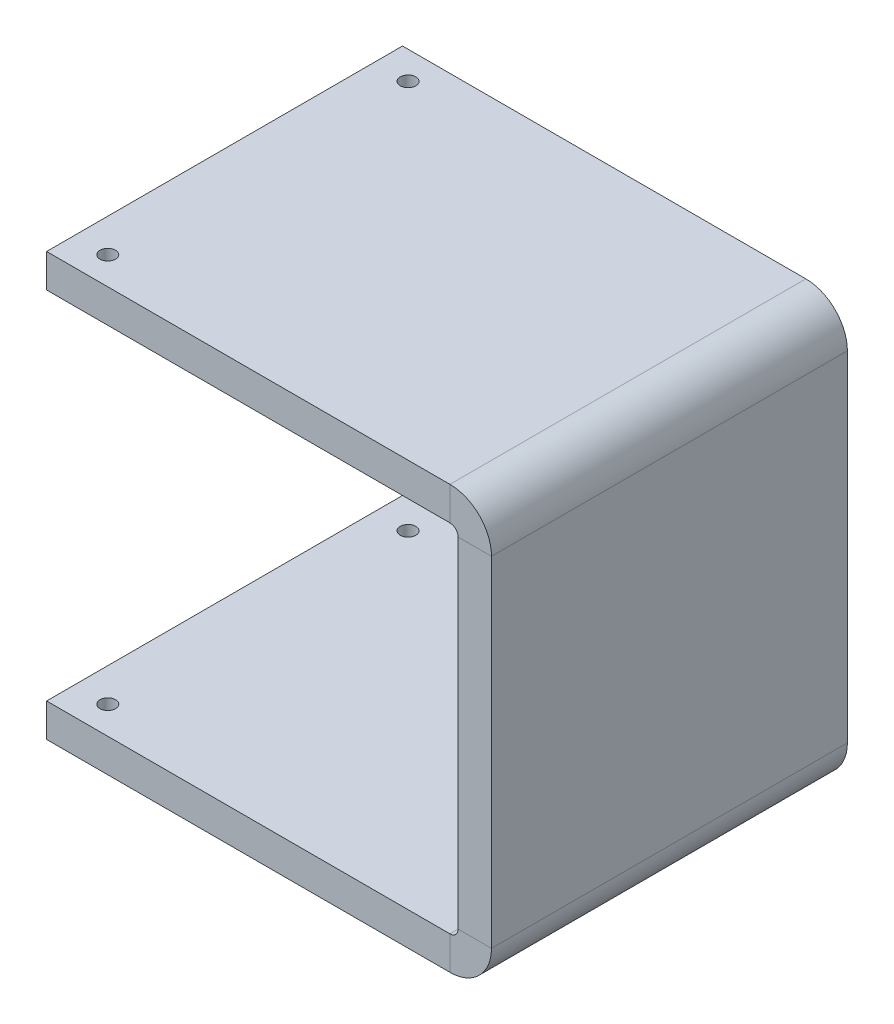
ISO-10303-21;
HEADER;
FILE_DESCRIPTION(('STEP AP214'),'2;1');
FILE_NAME('part.step','',(''),(''),'','','');
FILE_SCHEMA(('AUTOMOTIVE_DESIGN { 1 0 10303 214 1 1 1 1 }'));
ENDSEC;
DATA;
#1=APPLICATION_CONTEXT('core data for automotive mechanical design processes');
#2=APPLICATION_PROTOCOL_DEFINITION('international standard','automotive_design',2000,#1);
#3=PRODUCT_CONTEXT('',#1,'mechanical');
#4=PRODUCT('Part','Part','',(#3));
#5=PRODUCT_RELATED_PRODUCT_CATEGORY('part','',(#4));
#6=PRODUCT_DEFINITION_FORMATION('','',#4);
#7=PRODUCT_DEFINITION_CONTEXT('part definition',#1,'design');
#8=PRODUCT_DEFINITION('design','',#6,#7);
#9=PRODUCT_DEFINITION_SHAPE('','',#8);
#10=(LENGTH_UNIT() NAMED_UNIT(*) SI_UNIT(.MILLI.,.METRE.));
#11=(NAMED_UNIT(*) PLANE_ANGLE_UNIT() SI_UNIT($,.RADIAN.));
#12=(NAMED_UNIT(*) SI_UNIT($,.STERADIAN.) SOLID_ANGLE_UNIT());
#13=UNCERTAINTY_MEASURE_WITH_UNIT(LENGTH_MEASURE(1.E-05),#10,'distance_accuracy_value','');
#14=(GEOMETRIC_REPRESENTATION_CONTEXT(3) GLOBAL_UNCERTAINTY_ASSIGNED_CONTEXT((#13)) GLOBAL_UNIT_ASSIGNED_CONTEXT((#10,
#11,#12)) REPRESENTATION_CONTEXT('',''));
#15=CARTESIAN_POINT('',(0.,0.,0.));
#16=DIRECTION('',(0.,0.,1.));
#17=DIRECTION('',(1.,0.,0.));
#18=AXIS2_PLACEMENT_3D('',#15,#16,#17);
#19=CARTESIAN_POINT('',(0.,15.2634,32.));
#20=DIRECTION('',(0.,0.,1.));
#21=DIRECTION('',(1.,0.,0.));
#22=AXIS2_PLACEMENT_3D('',#19,#20,#21);
#23=PLANE('',#22);
#24=DIRECTION('',(-1.,0.,0.));
#25=VECTOR('',#24,1.);
#26=CARTESIAN_POINT('',(0.,15.2634,32.));
#27=LINE('',#26,#25);
#28=CARTESIAN_POINT('',(0.,15.2634,32.));
#29=VERTEX_POINT('',#28);
#30=CARTESIAN_POINT('',(-3.,15.2634,32.));
#31=VERTEX_POINT('',#30);
#32=EDGE_CURVE('E11',#29,#31,#27,.T.);
#33=ORIENTED_EDGE('',*,*,#32,.F.);
#34=CARTESIAN_POINT('',(-3.73659999999999,15.2634,32.));
#35=DIRECTION('',(0.,0.,1.));
#36=DIRECTION('',(1.,0.,0.));
#37=AXIS2_PLACEMENT_3D('',#34,#35,#36);
#38=CIRCLE('',#37,3.7366);
#39=CARTESIAN_POINT('',(-3.73659999999999,19.,32.));
#40=VERTEX_POINT('',#39);
#41=EDGE_CURVE('E277',#40,#29,#38,.F.);
#42=ORIENTED_EDGE('',*,*,#41,.F.);
#43=DIRECTION('',(0.,1.,0.));
#44=VECTOR('',#43,1.);
#45=CARTESIAN_POINT('',(-3.73659999999999,16.,32.));
#46=LINE('',#45,#44);
#47=CARTESIAN_POINT('',(-3.73659999999999,16.,32.));
#48=VERTEX_POINT('',#47);
#49=EDGE_CURVE('E44',#48,#40,#46,.T.);
#50=ORIENTED_EDGE('',*,*,#49,.F.);
#51=CARTESIAN_POINT('',(-3.73659999999999,15.2634,32.));
#52=DIRECTION('',(0.,0.,1.));
#53=DIRECTION('',(1.,0.,0.));
#54=AXIS2_PLACEMENT_3D('',#51,#52,#53);
#55=CIRCLE('',#54,0.7366);
#56=EDGE_CURVE('E146',#48,#31,#55,.F.);
#57=ORIENTED_EDGE('',*,*,#56,.T.);
#58=EDGE_LOOP('',(#33,#42,#50,#57));
#59=FACE_BOUND('',#58,.T.);
#60=ADVANCED_FACE('F35',(#59),#23,.T.);
#61=CARTESIAN_POINT('',(-3.73659999999999,16.,32.));
#62=DIRECTION('',(0.,0.,1.));
#63=DIRECTION('',(1.,0.,0.));
#64=AXIS2_PLACEMENT_3D('',#61,#62,#63);
#65=PLANE('',#64);
#66=DIRECTION('',(0.,-1.,0.));
#67=VECTOR('',#66,1.);
#68=CARTESIAN_POINT('',(0.,19.,32.));
#69=LINE('',#68,#67);
#70=CARTESIAN_POINT('',(0.,-15.2634,32.));
#71=VERTEX_POINT('',#70);
#72=EDGE_CURVE('E140',#29,#71,#69,.T.);
#73=ORIENTED_EDGE('',*,*,#72,.F.);
#74=ORIENTED_EDGE('',*,*,#32,.T.);
#75=DIRECTION('',(0.,1.,0.));
#76=VECTOR('',#75,1.);
#77=CARTESIAN_POINT('',(-3.,19.,32.));
#78=LINE('',#77,#76);
#79=CARTESIAN_POINT('',(-3.,-15.2634,32.));
#80=VERTEX_POINT('',#79);
#81=EDGE_CURVE('E137',#31,#80,#78,.F.);
#82=ORIENTED_EDGE('',*,*,#81,.T.);
#83=DIRECTION('',(1.,0.,0.));
#84=VECTOR('',#83,1.);
#85=CARTESIAN_POINT('',(-3.,-15.2634,32.));
#86=LINE('',#85,#84);
#87=EDGE_CURVE('E229',#80,#71,#86,.T.);
#88=ORIENTED_EDGE('',*,*,#87,.T.);
#89=EDGE_LOOP('',(#73,#74,#82,#88));
#90=FACE_BOUND('',#89,.T.);
#91=ADVANCED_FACE('F135',(#90),#65,.T.);
#92=CARTESIAN_POINT('',(-3.73659999999999,19.,0.));
#93=DIRECTION('',(0.,0.,-1.));
#94=DIRECTION('',(-1.,0.,0.));
#95=AXIS2_PLACEMENT_3D('',#92,#93,#94);
#96=PLANE('',#95);
#97=DIRECTION('',(0.,-1.,0.));
#98=VECTOR('',#97,1.);
#99=CARTESIAN_POINT('',(-3.73659999999999,19.,0.));
#100=LINE('',#99,#98);
#101=CARTESIAN_POINT('',(-3.73659999999999,19.,0.));
#102=VERTEX_POINT('',#101);
#103=CARTESIAN_POINT('',(-3.73659999999999,16.,0.));
#104=VERTEX_POINT('',#103);
#105=EDGE_CURVE('E234',#102,#104,#100,.T.);
#106=ORIENTED_EDGE('',*,*,#105,.F.);
#107=CARTESIAN_POINT('',(-3.73659999999999,15.2634,0.));
#108=DIRECTION('',(0.,0.,1.));
#109=DIRECTION('',(1.,0.,0.));
#110=AXIS2_PLACEMENT_3D('',#107,#108,#109);
#111=CIRCLE('',#110,3.7366);
#112=CARTESIAN_POINT('',(0.,15.2634,0.));
#113=VERTEX_POINT('',#112);
#114=EDGE_CURVE('E186',#102,#113,#111,.F.);
#115=ORIENTED_EDGE('',*,*,#114,.T.);
#116=DIRECTION('',(1.,0.,0.));
#117=VECTOR('',#116,1.);
#118=CARTESIAN_POINT('',(-3.,15.2634,0.));
#119=LINE('',#118,#117);
#120=CARTESIAN_POINT('',(-3.,15.2634,0.));
#121=VERTEX_POINT('',#120);
#122=EDGE_CURVE('E232',#121,#113,#119,.T.);
#123=ORIENTED_EDGE('',*,*,#122,.F.);
#124=CARTESIAN_POINT('',(-3.73659999999999,15.2634,0.));
#125=DIRECTION('',(0.,0.,1.));
#126=DIRECTION('',(1.,0.,0.));
#127=AXIS2_PLACEMENT_3D('',#124,#125,#126);
#128=CIRCLE('',#127,0.7366);
#129=EDGE_CURVE('E158',#104,#121,#128,.F.);
#130=ORIENTED_EDGE('',*,*,#129,.F.);
#131=EDGE_LOOP('',(#106,#115,#123,#130));
#132=FACE_BOUND('',#131,.T.);
#133=ADVANCED_FACE('F295',(#132),#96,.T.);
#134=CARTESIAN_POINT('',(-3.,15.2634,0.));
#135=DIRECTION('',(0.,0.,-1.));
#136=DIRECTION('',(-1.,0.,0.));
#137=AXIS2_PLACEMENT_3D('',#134,#135,#136);
#138=PLANE('',#137);
#139=DIRECTION('',(1.,0.,0.));
#140=VECTOR('',#139,1.);
#141=CARTESIAN_POINT('',(-40.,19.,0.));
#142=LINE('',#141,#140);
#143=CARTESIAN_POINT('',(-40.,19.,0.));
#144=VERTEX_POINT('',#143);
#145=EDGE_CURVE('E189',#144,#102,#142,.T.);
#146=ORIENTED_EDGE('',*,*,#145,.T.);
#147=ORIENTED_EDGE('',*,*,#105,.T.);
#148=DIRECTION('',(1.,0.,0.));
#149=VECTOR('',#148,1.);
#150=CARTESIAN_POINT('',(-40.,16.,0.));
#151=LINE('',#150,#149);
#152=CARTESIAN_POINT('',(-40.,16.,0.));
#153=VERTEX_POINT('',#152);
#154=EDGE_CURVE('E195',#153,#104,#151,.T.);
#155=ORIENTED_EDGE('',*,*,#154,.F.);
#156=DIRECTION('',(0.,1.,0.));
#157=VECTOR('',#156,1.);
#158=CARTESIAN_POINT('',(-40.,16.,0.));
#159=LINE('',#158,#157);
#160=EDGE_CURVE('E192',#153,#144,#159,.T.);
#161=ORIENTED_EDGE('',*,*,#160,.T.);
#162=EDGE_LOOP('',(#146,#147,#155,#161));
#163=FACE_BOUND('',#162,.T.);
#164=ADVANCED_FACE('F341',(#163),#138,.T.);
#165=CARTESIAN_POINT('',(-3.73659999999999,-19.,32.));
#166=DIRECTION('',(0.,0.,1.));
#167=DIRECTION('',(1.,0.,0.));
#168=AXIS2_PLACEMENT_3D('',#165,#166,#167);
#169=PLANE('',#168);
#170=DIRECTION('',(0.,1.,0.));
#171=VECTOR('',#170,1.);
#172=CARTESIAN_POINT('',(-3.73659999999999,-19.,32.));
#173=LINE('',#172,#171);
#174=CARTESIAN_POINT('',(-3.73659999999999,-19.,32.));
#175=VERTEX_POINT('',#174);
#176=CARTESIAN_POINT('',(-3.7366,-16.,32.));
#177=VERTEX_POINT('',#176);
#178=EDGE_CURVE('E53',#175,#177,#173,.T.);
#179=ORIENTED_EDGE('',*,*,#178,.F.);
#180=CARTESIAN_POINT('',(-3.7366,-15.2634,32.));
#181=DIRECTION('',(0.,0.,1.));
#182=DIRECTION('',(1.,0.,0.));
#183=AXIS2_PLACEMENT_3D('',#180,#181,#182);
#184=CIRCLE('',#183,3.7366);
#185=EDGE_CURVE('E273',#71,#175,#184,.F.);
#186=ORIENTED_EDGE('',*,*,#185,.F.);
#187=ORIENTED_EDGE('',*,*,#87,.F.);
#188=CARTESIAN_POINT('',(-3.7366,-15.2634,32.));
#189=DIRECTION('',(0.,0.,1.));
#190=DIRECTION('',(1.,0.,0.));
#191=AXIS2_PLACEMENT_3D('',#188,#189,#190);
#192=CIRCLE('',#191,0.7366);
#193=EDGE_CURVE('E166',#80,#177,#192,.F.);
#194=ORIENTED_EDGE('',*,*,#193,.T.);
#195=EDGE_LOOP('',(#179,#186,#187,#194));
#196=FACE_BOUND('',#195,.T.);
#197=ADVANCED_FACE('F346',(#196),#169,.T.);
#198=CARTESIAN_POINT('',(-3.,-15.2634,32.));
#199=DIRECTION('',(0.,0.,1.));
#200=DIRECTION('',(1.,0.,0.));
#201=AXIS2_PLACEMENT_3D('',#198,#199,#200);
#202=PLANE('',#201);
#203=DIRECTION('',(-1.,0.,0.));
#204=VECTOR('',#203,1.);
#205=CARTESIAN_POINT('',(0.,-19.,32.));
#206=LINE('',#205,#204);
#207=CARTESIAN_POINT('',(-40.,-19.,32.));
#208=VERTEX_POINT('',#207);
#209=EDGE_CURVE('E270',#175,#208,#206,.T.);
#210=ORIENTED_EDGE('',*,*,#209,.F.);
#211=ORIENTED_EDGE('',*,*,#178,.T.);
#212=DIRECTION('',(-1.,0.,0.));
#213=VECTOR('',#212,1.);
#214=CARTESIAN_POINT('',(0.,-16.,32.));
#215=LINE('',#214,#213);
#216=CARTESIAN_POINT('',(-40.,-16.,32.));
#217=VERTEX_POINT('',#216);
#218=EDGE_CURVE('E107',#177,#217,#215,.T.);
#219=ORIENTED_EDGE('',*,*,#218,.T.);
#220=DIRECTION('',(0.,1.,0.));
#221=VECTOR('',#220,1.);
#222=CARTESIAN_POINT('',(-40.,-19.,32.));
#223=LINE('',#222,#221);
#224=EDGE_CURVE('E267',#208,#217,#223,.T.);
#225=ORIENTED_EDGE('',*,*,#224,.F.);
#226=EDGE_LOOP('',(#210,#211,#219,#225));
#227=FACE_BOUND('',#226,.T.);
#228=ADVANCED_FACE('F322',(#227),#202,.T.);
#229=CARTESIAN_POINT('',(0.,-15.2634,0.));
#230=DIRECTION('',(0.,0.,-1.));
#231=DIRECTION('',(-1.,0.,0.));
#232=AXIS2_PLACEMENT_3D('',#229,#230,#231);
#233=PLANE('',#232);
#234=DIRECTION('',(-1.,0.,0.));
#235=VECTOR('',#234,1.);
#236=CARTESIAN_POINT('',(0.,-15.2634,0.));
#237=LINE('',#236,#235);
#238=CARTESIAN_POINT('',(0.,-15.2634,0.));
#239=VERTEX_POINT('',#238);
#240=CARTESIAN_POINT('',(-3.,-15.2634,0.));
#241=VERTEX_POINT('',#240);
#242=EDGE_CURVE('E94',#239,#241,#237,.T.);
#243=ORIENTED_EDGE('',*,*,#242,.F.);
#244=CARTESIAN_POINT('',(-3.7366,-15.2634,0.));
#245=DIRECTION('',(0.,0.,1.));
#246=DIRECTION('',(1.,0.,0.));
#247=AXIS2_PLACEMENT_3D('',#244,#245,#246);
#248=CIRCLE('',#247,3.7366);
#249=CARTESIAN_POINT('',(-3.73659999999999,-19.,0.));
#250=VERTEX_POINT('',#249);
#251=EDGE_CURVE('E182',#239,#250,#248,.F.);
#252=ORIENTED_EDGE('',*,*,#251,.T.);
#253=DIRECTION('',(0.,-1.,0.));
#254=VECTOR('',#253,1.);
#255=CARTESIAN_POINT('',(-3.7366,-16.,0.));
#256=LINE('',#255,#254);
#257=CARTESIAN_POINT('',(-3.7366,-16.,0.));
#258=VERTEX_POINT('',#257);
#259=EDGE_CURVE('E101',#258,#250,#256,.T.);
#260=ORIENTED_EDGE('',*,*,#259,.F.);
#261=CARTESIAN_POINT('',(-3.7366,-15.2634,0.));
#262=DIRECTION('',(0.,0.,1.));
#263=DIRECTION('',(1.,0.,0.));
#264=AXIS2_PLACEMENT_3D('',#261,#262,#263);
#265=CIRCLE('',#264,0.7366);
#266=EDGE_CURVE('E201',#241,#258,#265,.F.);
#267=ORIENTED_EDGE('',*,*,#266,.F.);
#268=EDGE_LOOP('',(#243,#252,#260,#267));
#269=FACE_BOUND('',#268,.T.);
#270=ADVANCED_FACE('F310',(#269),#233,.T.);
#271=CARTESIAN_POINT('',(-3.7366,-16.,0.));
#272=DIRECTION('',(0.,0.,-1.));
#273=DIRECTION('',(-1.,0.,0.));
#274=AXIS2_PLACEMENT_3D('',#271,#272,#273);
#275=PLANE('',#274);
#276=DIRECTION('',(0.,-1.,0.));
#277=VECTOR('',#276,1.);
#278=CARTESIAN_POINT('',(0.,19.,0.));
#279=LINE('',#278,#277);
#280=EDGE_CURVE('E184',#113,#239,#279,.T.);
#281=ORIENTED_EDGE('',*,*,#280,.T.);
#282=ORIENTED_EDGE('',*,*,#242,.T.);
#283=DIRECTION('',(0.,1.,0.));
#284=VECTOR('',#283,1.);
#285=CARTESIAN_POINT('',(-3.,19.,0.));
#286=LINE('',#285,#284);
#287=EDGE_CURVE('E199',#121,#241,#286,.F.);
#288=ORIENTED_EDGE('',*,*,#287,.F.);
#289=ORIENTED_EDGE('',*,*,#122,.T.);
#290=EDGE_LOOP('',(#281,#282,#288,#289));
#291=FACE_BOUND('',#290,.T.);
#292=ADVANCED_FACE('F297',(#291),#275,.T.);
#293=CARTESIAN_POINT('',(0.,-16.,32.));
#294=DIRECTION('',(0.,-1.,0.));
#295=DIRECTION('',(1.,0.,0.));
#296=AXIS2_PLACEMENT_3D('',#293,#294,#295);
#297=PLANE('',#296);
#298=CARTESIAN_POINT('',(-37.,-16.,29.5));
#299=DIRECTION('',(0.,-1.,0.));
#300=DIRECTION('',(1.,0.,0.));
#301=AXIS2_PLACEMENT_3D('',#298,#299,#300);
#302=CIRCLE('',#301,0.700000000000001);
#303=CARTESIAN_POINT('',(-36.3,-16.,29.5));
#304=VERTEX_POINT('',#303);
#305=EDGE_CURVE('E258',#304,#304,#302,.T.);
#306=ORIENTED_EDGE('',*,*,#305,.T.);
#307=EDGE_LOOP('',(#306));
#308=FACE_BOUND('',#307,.T.);
#309=CARTESIAN_POINT('',(-37.,-16.,2.5));
#310=DIRECTION('',(0.,-1.,0.));
#311=DIRECTION('',(1.,0.,0.));
#312=AXIS2_PLACEMENT_3D('',#309,#310,#311);
#313=CIRCLE('',#312,0.700000000000001);
#314=CARTESIAN_POINT('',(-36.3,-16.,2.5));
#315=VERTEX_POINT('',#314);
#316=EDGE_CURVE('E238',#315,#315,#313,.T.);
#317=ORIENTED_EDGE('',*,*,#316,.T.);
#318=EDGE_LOOP('',(#317));
#319=FACE_BOUND('',#318,.T.);
#320=CARTESIAN_POINT('',(-10.7366,-16.,16.));
#321=DIRECTION('',(0.,-1.,0.));
#322=DIRECTION('',(1.,0.,0.));
#323=AXIS2_PLACEMENT_3D('',#320,#321,#322);
#324=CIRCLE('',#323,4.5);
#325=CARTESIAN_POINT('',(-6.2366,-16.,16.));
#326=VERTEX_POINT('',#325);
#327=EDGE_CURVE('E176',#326,#326,#324,.T.);
#328=ORIENTED_EDGE('',*,*,#327,.T.);
#329=EDGE_LOOP('',(#328));
#330=FACE_BOUND('',#329,.T.);
#331=DIRECTION('',(-1.,0.,0.));
#332=VECTOR('',#331,1.);
#333=CARTESIAN_POINT('',(0.,-16.,0.));
#334=LINE('',#333,#332);
#335=CARTESIAN_POINT('',(-40.,-16.,0.));
#336=VERTEX_POINT('',#335);
#337=EDGE_CURVE('E172',#258,#336,#334,.T.);
#338=ORIENTED_EDGE('',*,*,#337,.T.);
#339=DIRECTION('',(0.,0.,-1.));
#340=VECTOR('',#339,1.);
#341=CARTESIAN_POINT('',(-40.,-16.,32.));
#342=LINE('',#341,#340);
#343=EDGE_CURVE('E225',#217,#336,#342,.T.);
#344=ORIENTED_EDGE('',*,*,#343,.F.);
#345=ORIENTED_EDGE('',*,*,#218,.F.);
#346=DIRECTION('',(0.,0.,-1.));
#347=VECTOR('',#346,1.);
#348=CARTESIAN_POINT('',(-3.7366,-16.,32.));
#349=LINE('',#348,#347);
#350=EDGE_CURVE('E168',#177,#258,#349,.T.);
#351=ORIENTED_EDGE('',*,*,#350,.T.);
#352=EDGE_LOOP('',(#338,#344,#345,#351));
#353=FACE_BOUND('',#352,.T.);
#354=ADVANCED_FACE('F316',(#308,#319,#330,#353),#297,.F.);
#355=CARTESIAN_POINT('',(-40.,-19.,32.));
#356=DIRECTION('',(-1.,0.,0.));
#357=DIRECTION('',(0.,0.,1.));
#358=AXIS2_PLACEMENT_3D('',#355,#356,#357);
#359=PLANE('',#358);
#360=DIRECTION('',(0.,1.,0.));
#361=VECTOR('',#360,1.);
#362=CARTESIAN_POINT('',(-40.,-19.,0.));
#363=LINE('',#362,#361);
#364=CARTESIAN_POINT('',(-40.,-19.,0.));
#365=VERTEX_POINT('',#364);
#366=EDGE_CURVE('E175',#365,#336,#363,.T.);
#367=ORIENTED_EDGE('',*,*,#366,.F.);
#368=DIRECTION('',(0.,0.,-1.));
#369=VECTOR('',#368,1.);
#370=CARTESIAN_POINT('',(-40.,-19.,32.));
#371=LINE('',#370,#369);
#372=EDGE_CURVE('E223',#208,#365,#371,.T.);
#373=ORIENTED_EDGE('',*,*,#372,.F.);
#374=ORIENTED_EDGE('',*,*,#224,.T.);
#375=ORIENTED_EDGE('',*,*,#343,.T.);
#376=EDGE_LOOP('',(#367,#373,#374,#375));
#377=FACE_BOUND('',#376,.T.);
#378=ADVANCED_FACE('F321',(#377),#359,.T.);
#379=CARTESIAN_POINT('',(0.,-19.,32.));
#380=DIRECTION('',(0.,-1.,0.));
#381=DIRECTION('',(1.,0.,0.));
#382=AXIS2_PLACEMENT_3D('',#379,#380,#381);
#383=PLANE('',#382);
#384=CARTESIAN_POINT('',(-37.,-19.,29.5));
#385=DIRECTION('',(0.,1.,0.));
#386=DIRECTION('',(0.,0.,1.));
#387=AXIS2_PLACEMENT_3D('',#384,#385,#386);
#388=CIRCLE('',#387,0.700000000000001);
#389=CARTESIAN_POINT('',(-37.,-19.,30.2));
#390=VERTEX_POINT('',#389);
#391=EDGE_CURVE('E239',#390,#390,#388,.T.);
#392=ORIENTED_EDGE('',*,*,#391,.T.);
#393=EDGE_LOOP('',(#392));
#394=FACE_BOUND('',#393,.T.);
#395=CARTESIAN_POINT('',(-37.,-19.,2.5));
#396=DIRECTION('',(0.,1.,0.));
#397=DIRECTION('',(0.,0.,-1.));
#398=AXIS2_PLACEMENT_3D('',#395,#396,#397);
#399=CIRCLE('',#398,0.700000000000001);
#400=CARTESIAN_POINT('',(-37.,-19.,1.8));
#401=VERTEX_POINT('',#400);
#402=EDGE_CURVE('E250',#401,#401,#399,.T.);
#403=ORIENTED_EDGE('',*,*,#402,.T.);
#404=EDGE_LOOP('',(#403));
#405=FACE_BOUND('',#404,.T.);
#406=CARTESIAN_POINT('',(-10.7366,-19.,16.));
#407=DIRECTION('',(0.,-1.,0.));
#408=DIRECTION('',(1.,0.,0.));
#409=AXIS2_PLACEMENT_3D('',#406,#407,#408);
#410=CIRCLE('',#409,4.5);
#411=CARTESIAN_POINT('',(-6.2366,-19.,16.));
#412=VERTEX_POINT('',#411);
#413=EDGE_CURVE('E261',#412,#412,#410,.T.);
#414=ORIENTED_EDGE('',*,*,#413,.F.);
#415=EDGE_LOOP('',(#414));
#416=FACE_BOUND('',#415,.T.);
#417=DIRECTION('',(-1.,0.,0.));
#418=VECTOR('',#417,1.);
#419=CARTESIAN_POINT('',(0.,-19.,0.));
#420=LINE('',#419,#418);
#421=EDGE_CURVE('E179',#250,#365,#420,.T.);
#422=ORIENTED_EDGE('',*,*,#421,.F.);
#423=DIRECTION('',(0.,0.,-1.));
#424=VECTOR('',#423,1.);
#425=CARTESIAN_POINT('',(-3.73659999999999,-19.,32.));
#426=LINE('',#425,#424);
#427=EDGE_CURVE('E220',#175,#250,#426,.T.);
#428=ORIENTED_EDGE('',*,*,#427,.F.);
#429=ORIENTED_EDGE('',*,*,#209,.T.);
#430=ORIENTED_EDGE('',*,*,#372,.T.);
#431=EDGE_LOOP('',(#422,#428,#429,#430));
#432=FACE_BOUND('',#431,.T.);
#433=ADVANCED_FACE('F324',(#394,#405,#416,#432),#383,.T.);
#434=CARTESIAN_POINT('',(-3.7366,-15.2634,32.));
#435=DIRECTION('',(0.,0.,-1.));
#436=DIRECTION('',(-1.,0.,0.));
#437=AXIS2_PLACEMENT_3D('',#434,#435,#436);
#438=CYLINDRICAL_SURFACE('',#437,3.7366);
#439=ORIENTED_EDGE('',*,*,#251,.F.);
#440=DIRECTION('',(0.,0.,-1.));
#441=VECTOR('',#440,1.);
#442=CARTESIAN_POINT('',(0.,-15.2634,32.));
#443=LINE('',#442,#441);
#444=EDGE_CURVE('E217',#71,#239,#443,.T.);
#445=ORIENTED_EDGE('',*,*,#444,.F.);
#446=ORIENTED_EDGE('',*,*,#185,.T.);
#447=ORIENTED_EDGE('',*,*,#427,.T.);
#448=EDGE_LOOP('',(#439,#445,#446,#447));
#449=FACE_BOUND('',#448,.T.);
#450=ADVANCED_FACE('F307',(#449),#438,.T.);
#451=CARTESIAN_POINT('',(0.,19.,32.));
#452=DIRECTION('',(1.,0.,0.));
#453=DIRECTION('',(0.,0.,-1.));
#454=AXIS2_PLACEMENT_3D('',#451,#452,#453);
#455=PLANE('',#454);
#456=ORIENTED_EDGE('',*,*,#280,.F.);
#457=DIRECTION('',(0.,0.,-1.));
#458=VECTOR('',#457,1.);
#459=CARTESIAN_POINT('',(0.,15.2634,32.));
#460=LINE('',#459,#458);
#461=EDGE_CURVE('E214',#29,#113,#460,.T.);
#462=ORIENTED_EDGE('',*,*,#461,.F.);
#463=ORIENTED_EDGE('',*,*,#72,.T.);
#464=ORIENTED_EDGE('',*,*,#444,.T.);
#465=EDGE_LOOP('',(#456,#462,#463,#464));
#466=FACE_BOUND('',#465,.T.);
#467=ADVANCED_FACE('F302',(#466),#455,.T.);
#468=CARTESIAN_POINT('',(-3.73659999999999,15.2634,32.));
#469=DIRECTION('',(0.,0.,-1.));
#470=DIRECTION('',(-1.,0.,0.));
#471=AXIS2_PLACEMENT_3D('',#468,#469,#470);
#472=CYLINDRICAL_SURFACE('',#471,3.7366);
#473=ORIENTED_EDGE('',*,*,#114,.F.);
#474=DIRECTION('',(0.,0.,-1.));
#475=VECTOR('',#474,1.);
#476=CARTESIAN_POINT('',(-3.73659999999999,19.,32.));
#477=LINE('',#476,#475);
#478=EDGE_CURVE('E211',#40,#102,#477,.T.);
#479=ORIENTED_EDGE('',*,*,#478,.F.);
#480=ORIENTED_EDGE('',*,*,#41,.T.);
#481=ORIENTED_EDGE('',*,*,#461,.T.);
#482=EDGE_LOOP('',(#473,#479,#480,#481));
#483=FACE_BOUND('',#482,.T.);
#484=ADVANCED_FACE('F300',(#483),#472,.T.);
#485=CARTESIAN_POINT('',(-40.,19.,32.));
#486=DIRECTION('',(0.,1.,0.));
#487=DIRECTION('',(0.,0.,1.));
#488=AXIS2_PLACEMENT_3D('',#485,#486,#487);
#489=PLANE('',#488);
#490=CARTESIAN_POINT('',(-37.,19.,29.5));
#491=DIRECTION('',(0.,1.,0.));
#492=DIRECTION('',(0.,0.,1.));
#493=AXIS2_PLACEMENT_3D('',#490,#491,#492);
#494=CIRCLE('',#493,0.700000000000001);
#495=CARTESIAN_POINT('',(-37.,19.,30.2));
#496=VERTEX_POINT('',#495);
#497=EDGE_CURVE('E245',#496,#496,#494,.T.);
#498=ORIENTED_EDGE('',*,*,#497,.F.);
#499=EDGE_LOOP('',(#498));
#500=FACE_BOUND('',#499,.T.);
#501=CARTESIAN_POINT('',(-37.,19.,2.5));
#502=DIRECTION('',(0.,1.,0.));
#503=DIRECTION('',(0.,0.,-1.));
#504=AXIS2_PLACEMENT_3D('',#501,#502,#503);
#505=CIRCLE('',#504,0.700000000000001);
#506=CARTESIAN_POINT('',(-37.,19.,1.8));
#507=VERTEX_POINT('',#506);
#508=EDGE_CURVE('E255',#507,#507,#505,.T.);
#509=ORIENTED_EDGE('',*,*,#508,.F.);
#510=EDGE_LOOP('',(#509));
#511=FACE_BOUND('',#510,.T.);
#512=ORIENTED_EDGE('',*,*,#145,.F.);
#513=DIRECTION('',(0.,0.,-1.));
#514=VECTOR('',#513,1.);
#515=CARTESIAN_POINT('',(-40.,19.,32.));
#516=LINE('',#515,#514);
#517=CARTESIAN_POINT('',(-40.,19.,32.));
#518=VERTEX_POINT('',#517);
#519=EDGE_CURVE('E209',#518,#144,#516,.T.);
#520=ORIENTED_EDGE('',*,*,#519,.F.);
#521=DIRECTION('',(1.,0.,0.));
#522=VECTOR('',#521,1.);
#523=CARTESIAN_POINT('',(-40.,19.,32.));
#524=LINE('',#523,#522);
#525=EDGE_CURVE('E279',#518,#40,#524,.T.);
#526=ORIENTED_EDGE('',*,*,#525,.T.);
#527=ORIENTED_EDGE('',*,*,#478,.T.);
#528=EDGE_LOOP('',(#512,#520,#526,#527));
#529=FACE_BOUND('',#528,.T.);
#530=ADVANCED_FACE('F397',(#500,#511,#529),#489,.T.);
#531=CARTESIAN_POINT('',(-40.,16.,32.));
#532=DIRECTION('',(-1.,0.,0.));
#533=DIRECTION('',(0.,0.,1.));
#534=AXIS2_PLACEMENT_3D('',#531,#532,#533);
#535=PLANE('',#534);
#536=ORIENTED_EDGE('',*,*,#160,.F.);
#537=DIRECTION('',(0.,0.,-1.));
#538=VECTOR('',#537,1.);
#539=CARTESIAN_POINT('',(-40.,16.,32.));
#540=LINE('',#539,#538);
#541=CARTESIAN_POINT('',(-40.,16.,32.));
#542=VERTEX_POINT('',#541);
#543=EDGE_CURVE('E207',#542,#153,#540,.T.);
#544=ORIENTED_EDGE('',*,*,#543,.F.);
#545=DIRECTION('',(0.,1.,0.));
#546=VECTOR('',#545,1.);
#547=CARTESIAN_POINT('',(-40.,16.,32.));
#548=LINE('',#547,#546);
#549=EDGE_CURVE('E282',#542,#518,#548,.T.);
#550=ORIENTED_EDGE('',*,*,#549,.T.);
#551=ORIENTED_EDGE('',*,*,#519,.T.);
#552=EDGE_LOOP('',(#536,#544,#550,#551));
#553=FACE_BOUND('',#552,.T.);
#554=ADVANCED_FACE('F393',(#553),#535,.T.);
#555=CARTESIAN_POINT('',(-40.,16.,32.));
#556=DIRECTION('',(0.,1.,0.));
#557=DIRECTION('',(0.,0.,1.));
#558=AXIS2_PLACEMENT_3D('',#555,#556,#557);
#559=PLANE('',#558);
#560=CARTESIAN_POINT('',(-37.,16.,29.5));
#561=DIRECTION('',(0.,1.,0.));
#562=DIRECTION('',(0.,0.,1.));
#563=AXIS2_PLACEMENT_3D('',#560,#561,#562);
#564=CIRCLE('',#563,0.700000000000001);
#565=CARTESIAN_POINT('',(-37.,16.,30.2));
#566=VERTEX_POINT('',#565);
#567=EDGE_CURVE('E38',#566,#566,#564,.T.);
#568=ORIENTED_EDGE('',*,*,#567,.T.);
#569=EDGE_LOOP('',(#568));
#570=FACE_BOUND('',#569,.T.);
#571=CARTESIAN_POINT('',(-37.,16.,2.5));
#572=DIRECTION('',(0.,1.,0.));
#573=DIRECTION('',(0.,0.,1.));
#574=AXIS2_PLACEMENT_3D('',#571,#572,#573);
#575=CIRCLE('',#574,0.700000000000001);
#576=CARTESIAN_POINT('',(-37.,16.,3.2));
#577=VERTEX_POINT('',#576);
#578=EDGE_CURVE('E236',#577,#577,#575,.T.);
#579=ORIENTED_EDGE('',*,*,#578,.T.);
#580=EDGE_LOOP('',(#579));
#581=FACE_BOUND('',#580,.T.);
#582=ORIENTED_EDGE('',*,*,#154,.T.);
#583=DIRECTION('',(0.,0.,-1.));
#584=VECTOR('',#583,1.);
#585=CARTESIAN_POINT('',(-3.73659999999999,16.,32.));
#586=LINE('',#585,#584);
#587=EDGE_CURVE('E160',#48,#104,#586,.T.);
#588=ORIENTED_EDGE('',*,*,#587,.F.);
#589=DIRECTION('',(1.,0.,0.));
#590=VECTOR('',#589,1.);
#591=CARTESIAN_POINT('',(-40.,16.,32.));
#592=LINE('',#591,#590);
#593=EDGE_CURVE('E151',#542,#48,#592,.T.);
#594=ORIENTED_EDGE('',*,*,#593,.F.);
#595=ORIENTED_EDGE('',*,*,#543,.T.);
#596=EDGE_LOOP('',(#582,#588,#594,#595));
#597=FACE_BOUND('',#596,.T.);
#598=ADVANCED_FACE('F292',(#570,#581,#597),#559,.F.);
#599=CARTESIAN_POINT('',(-3.73659999999999,15.2634,32.));
#600=DIRECTION('',(0.,0.,-1.));
#601=DIRECTION('',(-1.,0.,0.));
#602=AXIS2_PLACEMENT_3D('',#599,#600,#601);
#603=CYLINDRICAL_SURFACE('',#602,0.7366);
#604=ORIENTED_EDGE('',*,*,#129,.T.);
#605=DIRECTION('',(0.,0.,-1.));
#606=VECTOR('',#605,1.);
#607=CARTESIAN_POINT('',(-3.,15.2634,32.));
#608=LINE('',#607,#606);
#609=EDGE_CURVE('E155',#31,#121,#608,.T.);
#610=ORIENTED_EDGE('',*,*,#609,.F.);
#611=ORIENTED_EDGE('',*,*,#56,.F.);
#612=ORIENTED_EDGE('',*,*,#587,.T.);
#613=EDGE_LOOP('',(#604,#610,#611,#612));
#614=FACE_BOUND('',#613,.T.);
#615=ADVANCED_FACE('F156',(#614),#603,.F.);
#616=CARTESIAN_POINT('',(-3.,19.,32.));
#617=DIRECTION('',(1.,0.,0.));
#618=DIRECTION('',(0.,0.,-1.));
#619=AXIS2_PLACEMENT_3D('',#616,#617,#618);
#620=PLANE('',#619);
#621=ORIENTED_EDGE('',*,*,#287,.T.);
#622=DIRECTION('',(0.,0.,-1.));
#623=VECTOR('',#622,1.);
#624=CARTESIAN_POINT('',(-3.,-15.2634,32.));
#625=LINE('',#624,#623);
#626=EDGE_CURVE('E161',#80,#241,#625,.T.);
#627=ORIENTED_EDGE('',*,*,#626,.F.);
#628=ORIENTED_EDGE('',*,*,#81,.F.);
#629=ORIENTED_EDGE('',*,*,#609,.T.);
#630=EDGE_LOOP('',(#621,#627,#628,#629));
#631=FACE_BOUND('',#630,.T.);
#632=ADVANCED_FACE('F163',(#631),#620,.F.);
#633=CARTESIAN_POINT('',(-3.7366,-15.2634,32.));
#634=DIRECTION('',(0.,0.,-1.));
#635=DIRECTION('',(-1.,0.,0.));
#636=AXIS2_PLACEMENT_3D('',#633,#634,#635);
#637=CYLINDRICAL_SURFACE('',#636,0.7366);
#638=ORIENTED_EDGE('',*,*,#266,.T.);
#639=ORIENTED_EDGE('',*,*,#350,.F.);
#640=ORIENTED_EDGE('',*,*,#193,.F.);
#641=ORIENTED_EDGE('',*,*,#626,.T.);
#642=EDGE_LOOP('',(#638,#639,#640,#641));
#643=FACE_BOUND('',#642,.T.);
#644=ADVANCED_FACE('F313',(#643),#637,.F.);
#645=CARTESIAN_POINT('',(-3.7366,-15.2634,32.));
#646=DIRECTION('',(0.,0.,1.));
#647=DIRECTION('',(1.,0.,0.));
#648=AXIS2_PLACEMENT_3D('',#645,#646,#647);
#649=PLANE('',#648);
#650=ORIENTED_EDGE('',*,*,#593,.T.);
#651=ORIENTED_EDGE('',*,*,#49,.T.);
#652=ORIENTED_EDGE('',*,*,#525,.F.);
#653=ORIENTED_EDGE('',*,*,#549,.F.);
#654=EDGE_LOOP('',(#650,#651,#652,#653));
#655=FACE_BOUND('',#654,.T.);
#656=ADVANCED_FACE('F288',(#655),#649,.T.);
#657=CARTESIAN_POINT('',(-3.7366,-15.2634,0.));
#658=DIRECTION('',(0.,0.,1.));
#659=DIRECTION('',(1.,0.,0.));
#660=AXIS2_PLACEMENT_3D('',#657,#658,#659);
#661=PLANE('',#660);
#662=ORIENTED_EDGE('',*,*,#337,.F.);
#663=ORIENTED_EDGE('',*,*,#259,.T.);
#664=ORIENTED_EDGE('',*,*,#421,.T.);
#665=ORIENTED_EDGE('',*,*,#366,.T.);
#666=EDGE_LOOP('',(#662,#663,#664,#665));
#667=FACE_BOUND('',#666,.T.);
#668=ADVANCED_FACE('F318',(#667),#661,.F.);
#669=CARTESIAN_POINT('',(-10.7366,-9.,16.));
#670=DIRECTION('',(0.,-1.,0.));
#671=DIRECTION('',(1.,0.,0.));
#672=AXIS2_PLACEMENT_3D('',#669,#670,#671);
#673=CYLINDRICAL_SURFACE('',#672,4.5);
#674=ORIENTED_EDGE('',*,*,#413,.T.);
#675=EDGE_LOOP('',(#674));
#676=FACE_BOUND('',#675,.T.);
#677=ORIENTED_EDGE('',*,*,#327,.F.);
#678=EDGE_LOOP('',(#677));
#679=FACE_BOUND('',#678,.T.);
#680=ADVANCED_FACE('F367',(#676,#679),#673,.F.);
#681=CARTESIAN_POINT('',(-37.,-19.,2.5));
#682=DIRECTION('',(0.,1.,0.));
#683=DIRECTION('',(0.,0.,1.));
#684=AXIS2_PLACEMENT_3D('',#681,#682,#683);
#685=CYLINDRICAL_SURFACE('',#684,0.700000000000001);
#686=ORIENTED_EDGE('',*,*,#508,.T.);
#687=EDGE_LOOP('',(#686));
#688=FACE_BOUND('',#687,.T.);
#689=ORIENTED_EDGE('',*,*,#578,.F.);
#690=EDGE_LOOP('',(#689));
#691=FACE_BOUND('',#690,.T.);
#692=ADVANCED_FACE('F369',(#688,#691),#685,.F.);
#693=CARTESIAN_POINT('',(-37.,-19.,29.5));
#694=DIRECTION('',(0.,1.,0.));
#695=DIRECTION('',(0.,0.,1.));
#696=AXIS2_PLACEMENT_3D('',#693,#694,#695);
#697=CYLINDRICAL_SURFACE('',#696,0.700000000000001);
#698=ORIENTED_EDGE('',*,*,#497,.T.);
#699=EDGE_LOOP('',(#698));
#700=FACE_BOUND('',#699,.T.);
#701=ORIENTED_EDGE('',*,*,#567,.F.);
#702=EDGE_LOOP('',(#701));
#703=FACE_BOUND('',#702,.T.);
#704=ADVANCED_FACE('F376',(#700,#703),#697,.F.);
#705=ORIENTED_EDGE('',*,*,#402,.F.);
#706=EDGE_LOOP('',(#705));
#707=FACE_BOUND('',#706,.T.);
#708=ORIENTED_EDGE('',*,*,#316,.F.);
#709=EDGE_LOOP('',(#708));
#710=FACE_BOUND('',#709,.T.);
#711=ADVANCED_FACE('F379',(#707,#710),#685,.F.);
#712=ORIENTED_EDGE('',*,*,#391,.F.);
#713=EDGE_LOOP('',(#712));
#714=FACE_BOUND('',#713,.T.);
#715=ORIENTED_EDGE('',*,*,#305,.F.);
#716=EDGE_LOOP('',(#715));
#717=FACE_BOUND('',#716,.T.);
#718=ADVANCED_FACE('F589',(#714,#717),#697,.F.);
#719=CLOSED_SHELL('',(#60,#91,#133,#164,#197,#228,#270,#292,#354,#378,#433,#450,#467,#484,#530,
#554,#598,#615,#632,#644,#656,#668,#680,#692,#704,#711,#718));
#720=MANIFOLD_SOLID_BREP('B2',#719);
#721=ADVANCED_BREP_SHAPE_REPRESENTATION('',(#18,#720),#14);
#722=SHAPE_DEFINITION_REPRESENTATION(#9,#721);
ENDSEC;
END-ISO-10303-21;
